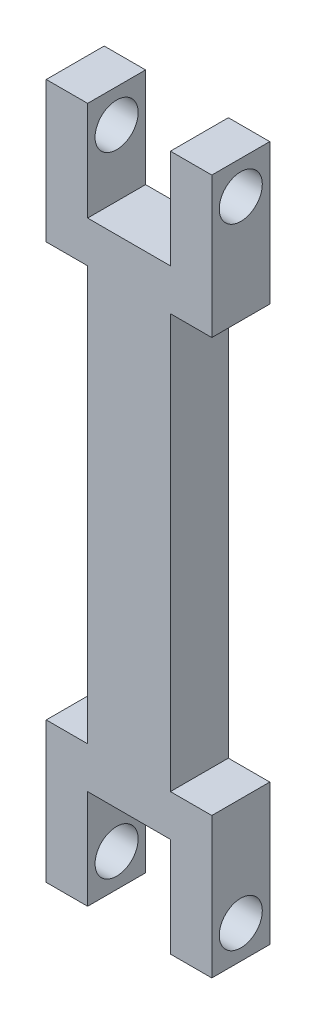
ISO-10303-21;
HEADER;
FILE_DESCRIPTION(('STEP AP214'),'2;1');
FILE_NAME('part.step','',(''),(''),'','','');
FILE_SCHEMA(('AUTOMOTIVE_DESIGN { 1 0 10303 214 1 1 1 1 }'));
ENDSEC;
DATA;
#1=APPLICATION_CONTEXT('core data for automotive mechanical design processes');
#2=APPLICATION_PROTOCOL_DEFINITION('international standard','automotive_design',2000,#1);
#3=PRODUCT_CONTEXT('',#1,'mechanical');
#4=PRODUCT('Part','Part','',(#3));
#5=PRODUCT_RELATED_PRODUCT_CATEGORY('part','',(#4));
#6=PRODUCT_DEFINITION_FORMATION('','',#4);
#7=PRODUCT_DEFINITION_CONTEXT('part definition',#1,'design');
#8=PRODUCT_DEFINITION('design','',#6,#7);
#9=PRODUCT_DEFINITION_SHAPE('','',#8);
#10=(LENGTH_UNIT() NAMED_UNIT(*) SI_UNIT(.MILLI.,.METRE.));
#11=(NAMED_UNIT(*) PLANE_ANGLE_UNIT() SI_UNIT($,.RADIAN.));
#12=(NAMED_UNIT(*) SI_UNIT($,.STERADIAN.) SOLID_ANGLE_UNIT());
#13=UNCERTAINTY_MEASURE_WITH_UNIT(LENGTH_MEASURE(1.E-05),#10,'distance_accuracy_value','');
#14=(GEOMETRIC_REPRESENTATION_CONTEXT(3) GLOBAL_UNCERTAINTY_ASSIGNED_CONTEXT((#13)) GLOBAL_UNIT_ASSIGNED_CONTEXT((#10,
#11,#12)) REPRESENTATION_CONTEXT('',''));
#15=CARTESIAN_POINT('',(0.,0.,0.));
#16=DIRECTION('',(0.,0.,1.));
#17=DIRECTION('',(1.,0.,0.));
#18=AXIS2_PLACEMENT_3D('',#15,#16,#17);
#19=CARTESIAN_POINT('',(0.,0.,0.));
#20=DIRECTION('',(0.,-1.,0.));
#21=DIRECTION('',(0.,0.,-1.));
#22=AXIS2_PLACEMENT_3D('',#19,#20,#21);
#23=PLANE('',#22);
#24=DIRECTION('',(-1.,0.,0.));
#25=VECTOR('',#24,1.);
#26=CARTESIAN_POINT('',(0.,0.,-8.89));
#27=LINE('',#26,#25);
#28=CARTESIAN_POINT('',(12.7,0.,-8.89));
#29=VERTEX_POINT('',#28);
#30=CARTESIAN_POINT('',(0.,0.,-8.89));
#31=VERTEX_POINT('',#30);
#32=EDGE_CURVE('E63',#29,#31,#27,.T.);
#33=ORIENTED_EDGE('',*,*,#32,.F.);
#34=DIRECTION('',(0.,0.,-1.));
#35=VECTOR('',#34,1.);
#36=CARTESIAN_POINT('',(12.7,0.,0.));
#37=LINE('',#36,#35);
#38=CARTESIAN_POINT('',(12.7,0.,0.));
#39=VERTEX_POINT('',#38);
#40=EDGE_CURVE('E188',#39,#29,#37,.T.);
#41=ORIENTED_EDGE('',*,*,#40,.F.);
#42=DIRECTION('',(1.,0.,0.));
#43=VECTOR('',#42,1.);
#44=CARTESIAN_POINT('',(0.,0.,0.));
#45=LINE('',#44,#43);
#46=CARTESIAN_POINT('',(0.,0.,0.));
#47=VERTEX_POINT('',#46);
#48=EDGE_CURVE('E210',#47,#39,#45,.T.);
#49=ORIENTED_EDGE('',*,*,#48,.F.);
#50=DIRECTION('',(0.,0.,1.));
#51=VECTOR('',#50,1.);
#52=CARTESIAN_POINT('',(0.,0.,0.));
#53=LINE('',#52,#51);
#54=EDGE_CURVE('E197',#31,#47,#53,.T.);
#55=ORIENTED_EDGE('',*,*,#54,.F.);
#56=EDGE_LOOP('',(#33,#41,#49,#55));
#57=FACE_BOUND('',#56,.T.);
#58=ADVANCED_FACE('F45',(#57),#23,.T.);
#59=CARTESIAN_POINT('',(0.,76.2,0.));
#60=DIRECTION('',(0.,-1.,0.));
#61=DIRECTION('',(0.,0.,-1.));
#62=AXIS2_PLACEMENT_3D('',#59,#60,#61);
#63=PLANE('',#62);
#64=DIRECTION('',(0.,0.,1.));
#65=VECTOR('',#64,1.);
#66=CARTESIAN_POINT('',(12.7,76.2,-8.89));
#67=LINE('',#66,#65);
#68=CARTESIAN_POINT('',(12.7,76.2,-8.89));
#69=VERTEX_POINT('',#68);
#70=CARTESIAN_POINT('',(12.7,76.2,0.));
#71=VERTEX_POINT('',#70);
#72=EDGE_CURVE('E297',#69,#71,#67,.T.);
#73=ORIENTED_EDGE('',*,*,#72,.F.);
#74=DIRECTION('',(-1.,0.,0.));
#75=VECTOR('',#74,1.);
#76=CARTESIAN_POINT('',(0.,76.2,-8.89));
#77=LINE('',#76,#75);
#78=CARTESIAN_POINT('',(0.,76.2,-8.89));
#79=VERTEX_POINT('',#78);
#80=EDGE_CURVE('E214',#69,#79,#77,.T.);
#81=ORIENTED_EDGE('',*,*,#80,.T.);
#82=DIRECTION('',(0.,0.,-1.));
#83=VECTOR('',#82,1.);
#84=CARTESIAN_POINT('',(0.,76.2,-8.89));
#85=LINE('',#84,#83);
#86=CARTESIAN_POINT('',(0.,76.2,0.));
#87=VERTEX_POINT('',#86);
#88=EDGE_CURVE('E71',#87,#79,#85,.T.);
#89=ORIENTED_EDGE('',*,*,#88,.F.);
#90=DIRECTION('',(1.,0.,0.));
#91=VECTOR('',#90,1.);
#92=CARTESIAN_POINT('',(0.,76.2,0.));
#93=LINE('',#92,#91);
#94=EDGE_CURVE('E209',#87,#71,#93,.T.);
#95=ORIENTED_EDGE('',*,*,#94,.T.);
#96=EDGE_LOOP('',(#73,#81,#89,#95));
#97=FACE_BOUND('',#96,.T.);
#98=ADVANCED_FACE('F423',(#97),#63,.F.);
#99=CARTESIAN_POINT('',(0.,76.2,0.));
#100=DIRECTION('',(1.,0.,0.));
#101=DIRECTION('',(0.,0.,-1.));
#102=AXIS2_PLACEMENT_3D('',#99,#100,#101);
#103=PLANE('',#102);
#104=DIRECTION('',(0.,0.,-1.));
#105=VECTOR('',#104,1.);
#106=CARTESIAN_POINT('',(0.,6.35,-8.89));
#107=LINE('',#106,#105);
#108=CARTESIAN_POINT('',(0.,6.35000000000002,0.));
#109=VERTEX_POINT('',#108);
#110=CARTESIAN_POINT('',(0.,6.35000000000002,-8.89));
#111=VERTEX_POINT('',#110);
#112=EDGE_CURVE('E347',#109,#111,#107,.T.);
#113=ORIENTED_EDGE('',*,*,#112,.F.);
#114=DIRECTION('',(0.,-1.,0.));
#115=VECTOR('',#114,1.);
#116=CARTESIAN_POINT('',(0.,76.2,0.));
#117=LINE('',#116,#115);
#118=CARTESIAN_POINT('',(0.,69.85,0.));
#119=VERTEX_POINT('',#118);
#120=EDGE_CURVE('E11',#119,#109,#117,.T.);
#121=ORIENTED_EDGE('',*,*,#120,.F.);
#122=DIRECTION('',(0.,0.,1.));
#123=VECTOR('',#122,1.);
#124=CARTESIAN_POINT('',(0.,69.85,-8.89));
#125=LINE('',#124,#123);
#126=CARTESIAN_POINT('',(0.,69.85,-8.89));
#127=VERTEX_POINT('',#126);
#128=EDGE_CURVE('E351',#127,#119,#125,.T.);
#129=ORIENTED_EDGE('',*,*,#128,.F.);
#130=DIRECTION('',(0.,-1.,0.));
#131=VECTOR('',#130,1.);
#132=CARTESIAN_POINT('',(0.,76.2,-8.89));
#133=LINE('',#132,#131);
#134=EDGE_CURVE('E220',#127,#111,#133,.T.);
#135=ORIENTED_EDGE('',*,*,#134,.T.);
#136=EDGE_LOOP('',(#113,#121,#129,#135));
#137=FACE_BOUND('',#136,.T.);
#138=ADVANCED_FACE('F47',(#137),#103,.F.);
#139=CARTESIAN_POINT('',(12.7,76.2,0.));
#140=DIRECTION('',(-1.,0.,0.));
#141=DIRECTION('',(0.,0.,1.));
#142=AXIS2_PLACEMENT_3D('',#139,#140,#141);
#143=PLANE('',#142);
#144=DIRECTION('',(0.,0.,-1.));
#145=VECTOR('',#144,1.);
#146=CARTESIAN_POINT('',(12.7,69.85,0.));
#147=LINE('',#146,#145);
#148=CARTESIAN_POINT('',(12.7,69.85,0.));
#149=VERTEX_POINT('',#148);
#150=CARTESIAN_POINT('',(12.7,69.85,-8.89));
#151=VERTEX_POINT('',#150);
#152=EDGE_CURVE('E389',#149,#151,#147,.T.);
#153=ORIENTED_EDGE('',*,*,#152,.F.);
#154=DIRECTION('',(0.,-1.,0.));
#155=VECTOR('',#154,1.);
#156=CARTESIAN_POINT('',(12.7,76.2,0.));
#157=LINE('',#156,#155);
#158=CARTESIAN_POINT('',(12.7,6.35,0.));
#159=VERTEX_POINT('',#158);
#160=EDGE_CURVE('E55',#149,#159,#157,.T.);
#161=ORIENTED_EDGE('',*,*,#160,.T.);
#162=DIRECTION('',(0.,0.,1.));
#163=VECTOR('',#162,1.);
#164=CARTESIAN_POINT('',(12.7,6.35,0.));
#165=LINE('',#164,#163);
#166=CARTESIAN_POINT('',(12.7,6.35000000000002,-8.89));
#167=VERTEX_POINT('',#166);
#168=EDGE_CURVE('E392',#167,#159,#165,.T.);
#169=ORIENTED_EDGE('',*,*,#168,.F.);
#170=DIRECTION('',(0.,-1.,0.));
#171=VECTOR('',#170,1.);
#172=CARTESIAN_POINT('',(12.7,76.2,-8.89));
#173=LINE('',#172,#171);
#174=EDGE_CURVE('E223',#151,#167,#173,.T.);
#175=ORIENTED_EDGE('',*,*,#174,.F.);
#176=EDGE_LOOP('',(#153,#161,#169,#175));
#177=FACE_BOUND('',#176,.T.);
#178=ADVANCED_FACE('F459',(#177),#143,.F.);
#179=CARTESIAN_POINT('',(0.,76.2,0.));
#180=DIRECTION('',(0.,0.,-1.));
#181=DIRECTION('',(-1.,0.,0.));
#182=AXIS2_PLACEMENT_3D('',#179,#180,#181);
#183=PLANE('',#182);
#184=DIRECTION('',(0.,1.,0.));
#185=VECTOR('',#184,1.);
#186=CARTESIAN_POINT('',(-6.35,0.,0.));
#187=LINE('',#186,#185);
#188=CARTESIAN_POINT('',(-6.35,-15.24,0.));
#189=VERTEX_POINT('',#188);
#190=CARTESIAN_POINT('',(-6.35,6.35,0.));
#191=VERTEX_POINT('',#190);
#192=EDGE_CURVE('E355',#189,#191,#187,.T.);
#193=ORIENTED_EDGE('',*,*,#192,.F.);
#194=DIRECTION('',(-1.,0.,0.));
#195=VECTOR('',#194,1.);
#196=CARTESIAN_POINT('',(-6.35,-15.24,0.));
#197=LINE('',#196,#195);
#198=CARTESIAN_POINT('',(0.,-15.24,0.));
#199=VERTEX_POINT('',#198);
#200=EDGE_CURVE('E266',#199,#189,#197,.T.);
#201=ORIENTED_EDGE('',*,*,#200,.F.);
#202=DIRECTION('',(0.,1.,0.));
#203=VECTOR('',#202,1.);
#204=CARTESIAN_POINT('',(0.,-15.24,0.));
#205=LINE('',#204,#203);
#206=EDGE_CURVE('E280',#199,#47,#205,.T.);
#207=ORIENTED_EDGE('',*,*,#206,.T.);
#208=ORIENTED_EDGE('',*,*,#48,.T.);
#209=DIRECTION('',(0.,1.,0.));
#210=VECTOR('',#209,1.);
#211=CARTESIAN_POINT('',(12.7,-15.24,0.));
#212=LINE('',#211,#210);
#213=CARTESIAN_POINT('',(12.7,-15.24,0.));
#214=VERTEX_POINT('',#213);
#215=EDGE_CURVE('E193',#214,#39,#212,.T.);
#216=ORIENTED_EDGE('',*,*,#215,.F.);
#217=DIRECTION('',(-1.,0.,0.));
#218=VECTOR('',#217,1.);
#219=CARTESIAN_POINT('',(19.05,-15.24,0.));
#220=LINE('',#219,#218);
#221=CARTESIAN_POINT('',(19.05,-15.24,0.));
#222=VERTEX_POINT('',#221);
#223=EDGE_CURVE('E198',#222,#214,#220,.T.);
#224=ORIENTED_EDGE('',*,*,#223,.F.);
#225=DIRECTION('',(0.,-1.,0.));
#226=VECTOR('',#225,1.);
#227=CARTESIAN_POINT('',(19.05,0.,0.));
#228=LINE('',#227,#226);
#229=CARTESIAN_POINT('',(19.05,6.35,0.));
#230=VERTEX_POINT('',#229);
#231=EDGE_CURVE('E402',#230,#222,#228,.T.);
#232=ORIENTED_EDGE('',*,*,#231,.F.);
#233=DIRECTION('',(-1.,0.,0.));
#234=VECTOR('',#233,1.);
#235=CARTESIAN_POINT('',(19.05,6.35,0.));
#236=LINE('',#235,#234);
#237=EDGE_CURVE('E411',#230,#159,#236,.T.);
#238=ORIENTED_EDGE('',*,*,#237,.T.);
#239=ORIENTED_EDGE('',*,*,#160,.F.);
#240=DIRECTION('',(-1.,0.,0.));
#241=VECTOR('',#240,1.);
#242=CARTESIAN_POINT('',(19.05,69.85,0.));
#243=LINE('',#242,#241);
#244=CARTESIAN_POINT('',(19.05,69.85,0.));
#245=VERTEX_POINT('',#244);
#246=EDGE_CURVE('E381',#245,#149,#243,.T.);
#247=ORIENTED_EDGE('',*,*,#246,.F.);
#248=DIRECTION('',(0.,-1.,0.));
#249=VECTOR('',#248,1.);
#250=CARTESIAN_POINT('',(19.05,76.2,0.));
#251=LINE('',#250,#249);
#252=CARTESIAN_POINT('',(19.05,91.44,0.));
#253=VERTEX_POINT('',#252);
#254=EDGE_CURVE('E393',#253,#245,#251,.T.);
#255=ORIENTED_EDGE('',*,*,#254,.F.);
#256=DIRECTION('',(1.,0.,0.));
#257=VECTOR('',#256,1.);
#258=CARTESIAN_POINT('',(19.05,91.44,0.));
#259=LINE('',#258,#257);
#260=CARTESIAN_POINT('',(12.7,91.44,0.));
#261=VERTEX_POINT('',#260);
#262=EDGE_CURVE('E304',#261,#253,#259,.T.);
#263=ORIENTED_EDGE('',*,*,#262,.F.);
#264=DIRECTION('',(0.,-1.,0.));
#265=VECTOR('',#264,1.);
#266=CARTESIAN_POINT('',(12.7,91.44,0.));
#267=LINE('',#266,#265);
#268=EDGE_CURVE('E292',#261,#71,#267,.T.);
#269=ORIENTED_EDGE('',*,*,#268,.T.);
#270=ORIENTED_EDGE('',*,*,#94,.F.);
#271=DIRECTION('',(0.,-1.,0.));
#272=VECTOR('',#271,1.);
#273=CARTESIAN_POINT('',(0.,91.44,0.));
#274=LINE('',#273,#272);
#275=CARTESIAN_POINT('',(0.,91.44,0.));
#276=VERTEX_POINT('',#275);
#277=EDGE_CURVE('E334',#276,#87,#274,.T.);
#278=ORIENTED_EDGE('',*,*,#277,.F.);
#279=DIRECTION('',(1.,0.,0.));
#280=VECTOR('',#279,1.);
#281=CARTESIAN_POINT('',(-6.35,91.44,0.));
#282=LINE('',#281,#280);
#283=CARTESIAN_POINT('',(-6.35,91.44,0.));
#284=VERTEX_POINT('',#283);
#285=EDGE_CURVE('E322',#284,#276,#282,.T.);
#286=ORIENTED_EDGE('',*,*,#285,.F.);
#287=DIRECTION('',(0.,1.,0.));
#288=VECTOR('',#287,1.);
#289=CARTESIAN_POINT('',(-6.35,76.2,0.));
#290=LINE('',#289,#288);
#291=CARTESIAN_POINT('',(-6.35,69.85,0.));
#292=VERTEX_POINT('',#291);
#293=EDGE_CURVE('E367',#292,#284,#290,.T.);
#294=ORIENTED_EDGE('',*,*,#293,.F.);
#295=DIRECTION('',(1.,0.,0.));
#296=VECTOR('',#295,1.);
#297=CARTESIAN_POINT('',(-6.35,69.85,0.));
#298=LINE('',#297,#296);
#299=EDGE_CURVE('E370',#292,#119,#298,.T.);
#300=ORIENTED_EDGE('',*,*,#299,.T.);
#301=ORIENTED_EDGE('',*,*,#120,.T.);
#302=DIRECTION('',(1.,0.,0.));
#303=VECTOR('',#302,1.);
#304=CARTESIAN_POINT('',(-6.35,6.35,0.));
#305=LINE('',#304,#303);
#306=EDGE_CURVE('E338',#191,#109,#305,.T.);
#307=ORIENTED_EDGE('',*,*,#306,.F.);
#308=EDGE_LOOP('',(#193,#201,#207,#208,#216,#224,#232,#238,#239,#247,#255,#263,#269,#270,#278,
#286,#294,#300,#301,#307));
#309=FACE_BOUND('',#308,.T.);
#310=ADVANCED_FACE('F438',(#309),#183,.F.);
#311=CARTESIAN_POINT('',(0.,76.2,-8.89));
#312=DIRECTION('',(0.,0.,1.));
#313=DIRECTION('',(1.,0.,0.));
#314=AXIS2_PLACEMENT_3D('',#311,#312,#313);
#315=PLANE('',#314);
#316=DIRECTION('',(0.,1.,0.));
#317=VECTOR('',#316,1.);
#318=CARTESIAN_POINT('',(19.05,0.,-8.89));
#319=LINE('',#318,#317);
#320=CARTESIAN_POINT('',(19.05,-15.24,-8.89));
#321=VERTEX_POINT('',#320);
#322=CARTESIAN_POINT('',(19.05,6.35,-8.89));
#323=VERTEX_POINT('',#322);
#324=EDGE_CURVE('E405',#321,#323,#319,.T.);
#325=ORIENTED_EDGE('',*,*,#324,.F.);
#326=DIRECTION('',(1.,0.,0.));
#327=VECTOR('',#326,1.);
#328=CARTESIAN_POINT('',(19.05,-15.24,-8.89));
#329=LINE('',#328,#327);
#330=CARTESIAN_POINT('',(12.7,-15.24,-8.89));
#331=VERTEX_POINT('',#330);
#332=EDGE_CURVE('E202',#331,#321,#329,.T.);
#333=ORIENTED_EDGE('',*,*,#332,.F.);
#334=DIRECTION('',(0.,1.,0.));
#335=VECTOR('',#334,1.);
#336=CARTESIAN_POINT('',(12.7,-15.24,-8.89));
#337=LINE('',#336,#335);
#338=EDGE_CURVE('E190',#331,#29,#337,.T.);
#339=ORIENTED_EDGE('',*,*,#338,.T.);
#340=ORIENTED_EDGE('',*,*,#32,.T.);
#341=DIRECTION('',(0.,1.,0.));
#342=VECTOR('',#341,1.);
#343=CARTESIAN_POINT('',(0.,-15.24,-8.89));
#344=LINE('',#343,#342);
#345=CARTESIAN_POINT('',(0.,-15.24,-8.89));
#346=VERTEX_POINT('',#345);
#347=EDGE_CURVE('E286',#346,#31,#344,.T.);
#348=ORIENTED_EDGE('',*,*,#347,.F.);
#349=DIRECTION('',(1.,0.,0.));
#350=VECTOR('',#349,1.);
#351=CARTESIAN_POINT('',(-6.35,-15.24,-8.89));
#352=LINE('',#351,#350);
#353=CARTESIAN_POINT('',(-6.35,-15.24,-8.89));
#354=VERTEX_POINT('',#353);
#355=EDGE_CURVE('E274',#354,#346,#352,.T.);
#356=ORIENTED_EDGE('',*,*,#355,.F.);
#357=DIRECTION('',(0.,-1.,0.));
#358=VECTOR('',#357,1.);
#359=CARTESIAN_POINT('',(-6.35,0.,-8.89));
#360=LINE('',#359,#358);
#361=CARTESIAN_POINT('',(-6.35,6.35,-8.89));
#362=VERTEX_POINT('',#361);
#363=EDGE_CURVE('E352',#362,#354,#360,.T.);
#364=ORIENTED_EDGE('',*,*,#363,.F.);
#365=DIRECTION('',(1.,0.,0.));
#366=VECTOR('',#365,1.);
#367=CARTESIAN_POINT('',(-6.35,6.35,-8.89));
#368=LINE('',#367,#366);
#369=EDGE_CURVE('E342',#362,#111,#368,.T.);
#370=ORIENTED_EDGE('',*,*,#369,.T.);
#371=ORIENTED_EDGE('',*,*,#134,.F.);
#372=DIRECTION('',(1.,0.,0.));
#373=VECTOR('',#372,1.);
#374=CARTESIAN_POINT('',(-6.35,69.85,-8.89));
#375=LINE('',#374,#373);
#376=CARTESIAN_POINT('',(-6.35,69.85,-8.89));
#377=VERTEX_POINT('',#376);
#378=EDGE_CURVE('E377',#377,#127,#375,.T.);
#379=ORIENTED_EDGE('',*,*,#378,.F.);
#380=DIRECTION('',(0.,-1.,0.));
#381=VECTOR('',#380,1.);
#382=CARTESIAN_POINT('',(-6.35,76.2,-8.89));
#383=LINE('',#382,#381);
#384=CARTESIAN_POINT('',(-6.35,91.44,-8.89));
#385=VERTEX_POINT('',#384);
#386=EDGE_CURVE('E360',#385,#377,#383,.T.);
#387=ORIENTED_EDGE('',*,*,#386,.F.);
#388=DIRECTION('',(-1.,0.,0.));
#389=VECTOR('',#388,1.);
#390=CARTESIAN_POINT('',(-6.35,91.44,-8.89));
#391=LINE('',#390,#389);
#392=CARTESIAN_POINT('',(0.,91.44,-8.89));
#393=VERTEX_POINT('',#392);
#394=EDGE_CURVE('E314',#393,#385,#391,.T.);
#395=ORIENTED_EDGE('',*,*,#394,.F.);
#396=DIRECTION('',(0.,-1.,0.));
#397=VECTOR('',#396,1.);
#398=CARTESIAN_POINT('',(0.,91.44,-8.89));
#399=LINE('',#398,#397);
#400=EDGE_CURVE('E328',#393,#79,#399,.T.);
#401=ORIENTED_EDGE('',*,*,#400,.T.);
#402=ORIENTED_EDGE('',*,*,#80,.F.);
#403=DIRECTION('',(0.,-1.,0.));
#404=VECTOR('',#403,1.);
#405=CARTESIAN_POINT('',(12.7,91.44,-8.89));
#406=LINE('',#405,#404);
#407=CARTESIAN_POINT('',(12.7,91.44,-8.89));
#408=VERTEX_POINT('',#407);
#409=EDGE_CURVE('E289',#408,#69,#406,.T.);
#410=ORIENTED_EDGE('',*,*,#409,.F.);
#411=DIRECTION('',(-1.,0.,0.));
#412=VECTOR('',#411,1.);
#413=CARTESIAN_POINT('',(19.05,91.44,-8.89));
#414=LINE('',#413,#412);
#415=CARTESIAN_POINT('',(19.05,91.44,-8.89));
#416=VERTEX_POINT('',#415);
#417=EDGE_CURVE('E300',#416,#408,#414,.T.);
#418=ORIENTED_EDGE('',*,*,#417,.F.);
#419=DIRECTION('',(0.,1.,0.));
#420=VECTOR('',#419,1.);
#421=CARTESIAN_POINT('',(19.05,76.2,-8.89));
#422=LINE('',#421,#420);
#423=CARTESIAN_POINT('',(19.05,69.85,-8.89));
#424=VERTEX_POINT('',#423);
#425=EDGE_CURVE('E388',#424,#416,#422,.T.);
#426=ORIENTED_EDGE('',*,*,#425,.F.);
#427=DIRECTION('',(-1.,0.,0.));
#428=VECTOR('',#427,1.);
#429=CARTESIAN_POINT('',(19.05,69.85,-8.89));
#430=LINE('',#429,#428);
#431=EDGE_CURVE('E384',#424,#151,#430,.T.);
#432=ORIENTED_EDGE('',*,*,#431,.T.);
#433=ORIENTED_EDGE('',*,*,#174,.T.);
#434=DIRECTION('',(-1.,0.,0.));
#435=VECTOR('',#434,1.);
#436=CARTESIAN_POINT('',(19.05,6.35,-8.89));
#437=LINE('',#436,#435);
#438=EDGE_CURVE('E216',#323,#167,#437,.T.);
#439=ORIENTED_EDGE('',*,*,#438,.F.);
#440=EDGE_LOOP('',(#325,#333,#339,#340,#348,#356,#364,#370,#371,#379,#387,#395,#401,#402,#410,
#418,#426,#432,#433,#439));
#441=FACE_BOUND('',#440,.T.);
#442=ADVANCED_FACE('F200',(#441),#315,.F.);
#443=CARTESIAN_POINT('',(19.05,6.35,0.));
#444=DIRECTION('',(0.,-1.,0.));
#445=DIRECTION('',(0.,0.,-1.));
#446=AXIS2_PLACEMENT_3D('',#443,#444,#445);
#447=PLANE('',#446);
#448=ORIENTED_EDGE('',*,*,#168,.T.);
#449=ORIENTED_EDGE('',*,*,#237,.F.);
#450=DIRECTION('',(0.,0.,1.));
#451=VECTOR('',#450,1.);
#452=CARTESIAN_POINT('',(19.05,6.35,0.));
#453=LINE('',#452,#451);
#454=EDGE_CURVE('E408',#323,#230,#453,.T.);
#455=ORIENTED_EDGE('',*,*,#454,.F.);
#456=ORIENTED_EDGE('',*,*,#438,.T.);
#457=EDGE_LOOP('',(#448,#449,#455,#456));
#458=FACE_BOUND('',#457,.T.);
#459=ADVANCED_FACE('F464',(#458),#447,.F.);
#460=CARTESIAN_POINT('',(19.05,0.,0.));
#461=DIRECTION('',(-1.,0.,0.));
#462=DIRECTION('',(0.,0.,1.));
#463=AXIS2_PLACEMENT_3D('',#460,#461,#462);
#464=PLANE('',#463);
#465=CARTESIAN_POINT('',(19.05,-10.16,-4.445));
#466=DIRECTION('',(1.,0.,0.));
#467=DIRECTION('',(0.,0.,-1.));
#468=AXIS2_PLACEMENT_3D('',#465,#466,#467);
#469=CIRCLE('',#468,3.302);
#470=CARTESIAN_POINT('',(19.05,-10.16,-7.747));
#471=VERTEX_POINT('',#470);
#472=EDGE_CURVE('E231',#471,#471,#469,.T.);
#473=ORIENTED_EDGE('',*,*,#472,.F.);
#474=EDGE_LOOP('',(#473));
#475=FACE_BOUND('',#474,.T.);
#476=ORIENTED_EDGE('',*,*,#231,.T.);
#477=DIRECTION('',(0.,0.,1.));
#478=VECTOR('',#477,1.);
#479=CARTESIAN_POINT('',(19.05,-15.24,0.));
#480=LINE('',#479,#478);
#481=EDGE_CURVE('E204',#321,#222,#480,.T.);
#482=ORIENTED_EDGE('',*,*,#481,.F.);
#483=ORIENTED_EDGE('',*,*,#324,.T.);
#484=ORIENTED_EDGE('',*,*,#454,.T.);
#485=EDGE_LOOP('',(#476,#482,#483,#484));
#486=FACE_BOUND('',#485,.T.);
#487=ADVANCED_FACE('F470',(#475,#486),#464,.F.);
#488=CARTESIAN_POINT('',(19.05,69.85,0.));
#489=DIRECTION('',(0.,1.,0.));
#490=DIRECTION('',(0.,0.,1.));
#491=AXIS2_PLACEMENT_3D('',#488,#489,#490);
#492=PLANE('',#491);
#493=ORIENTED_EDGE('',*,*,#152,.T.);
#494=ORIENTED_EDGE('',*,*,#431,.F.);
#495=DIRECTION('',(0.,0.,-1.));
#496=VECTOR('',#495,1.);
#497=CARTESIAN_POINT('',(19.05,69.85,0.));
#498=LINE('',#497,#496);
#499=EDGE_CURVE('E396',#245,#424,#498,.T.);
#500=ORIENTED_EDGE('',*,*,#499,.F.);
#501=ORIENTED_EDGE('',*,*,#246,.T.);
#502=EDGE_LOOP('',(#493,#494,#500,#501));
#503=FACE_BOUND('',#502,.T.);
#504=ADVANCED_FACE('F453',(#503),#492,.F.);
#505=CARTESIAN_POINT('',(19.05,0.,0.));
#506=DIRECTION('',(1.,0.,0.));
#507=DIRECTION('',(0.,0.,-1.));
#508=AXIS2_PLACEMENT_3D('',#505,#506,#507);
#509=PLANE('',#508);
#510=CARTESIAN_POINT('',(19.05,86.36,-4.445));
#511=DIRECTION('',(1.,0.,0.));
#512=DIRECTION('',(0.,0.,-1.));
#513=AXIS2_PLACEMENT_3D('',#510,#511,#512);
#514=CIRCLE('',#513,3.30199999999999);
#515=CARTESIAN_POINT('',(19.05,86.36,-7.74699999999999));
#516=VERTEX_POINT('',#515);
#517=EDGE_CURVE('E793',#516,#516,#514,.T.);
#518=ORIENTED_EDGE('',*,*,#517,.F.);
#519=EDGE_LOOP('',(#518));
#520=FACE_BOUND('',#519,.T.);
#521=ORIENTED_EDGE('',*,*,#254,.T.);
#522=ORIENTED_EDGE('',*,*,#499,.T.);
#523=ORIENTED_EDGE('',*,*,#425,.T.);
#524=DIRECTION('',(0.,0.,-1.));
#525=VECTOR('',#524,1.);
#526=CARTESIAN_POINT('',(19.05,91.44,-8.89));
#527=LINE('',#526,#525);
#528=EDGE_CURVE('E296',#253,#416,#527,.T.);
#529=ORIENTED_EDGE('',*,*,#528,.F.);
#530=EDGE_LOOP('',(#521,#522,#523,#529));
#531=FACE_BOUND('',#530,.T.);
#532=ADVANCED_FACE('F449',(#520,#531),#509,.T.);
#533=CARTESIAN_POINT('',(-6.35,69.85,-8.89));
#534=DIRECTION('',(0.,1.,0.));
#535=DIRECTION('',(0.,0.,1.));
#536=AXIS2_PLACEMENT_3D('',#533,#534,#535);
#537=PLANE('',#536);
#538=ORIENTED_EDGE('',*,*,#128,.T.);
#539=ORIENTED_EDGE('',*,*,#299,.F.);
#540=DIRECTION('',(0.,0.,1.));
#541=VECTOR('',#540,1.);
#542=CARTESIAN_POINT('',(-6.35,69.85,-8.89));
#543=LINE('',#542,#541);
#544=EDGE_CURVE('E364',#377,#292,#543,.T.);
#545=ORIENTED_EDGE('',*,*,#544,.F.);
#546=ORIENTED_EDGE('',*,*,#378,.T.);
#547=EDGE_LOOP('',(#538,#539,#545,#546));
#548=FACE_BOUND('',#547,.T.);
#549=ADVANCED_FACE('F492',(#548),#537,.F.);
#550=CARTESIAN_POINT('',(-6.35,0.,0.));
#551=DIRECTION('',(-1.,0.,0.));
#552=DIRECTION('',(0.,0.,1.));
#553=AXIS2_PLACEMENT_3D('',#550,#551,#552);
#554=PLANE('',#553);
#555=CARTESIAN_POINT('',(-6.35,86.36,-4.445));
#556=DIRECTION('',(-1.,0.,0.));
#557=DIRECTION('',(0.,0.,1.));
#558=AXIS2_PLACEMENT_3D('',#555,#556,#557);
#559=CIRCLE('',#558,3.30199999999999);
#560=CARTESIAN_POINT('',(-6.35,86.36,-1.14300000000001));
#561=VERTEX_POINT('',#560);
#562=EDGE_CURVE('E240',#561,#561,#559,.T.);
#563=ORIENTED_EDGE('',*,*,#562,.F.);
#564=EDGE_LOOP('',(#563));
#565=FACE_BOUND('',#564,.T.);
#566=ORIENTED_EDGE('',*,*,#386,.T.);
#567=ORIENTED_EDGE('',*,*,#544,.T.);
#568=ORIENTED_EDGE('',*,*,#293,.T.);
#569=DIRECTION('',(0.,0.,1.));
#570=VECTOR('',#569,1.);
#571=CARTESIAN_POINT('',(-6.35,91.44,-8.89));
#572=LINE('',#571,#570);
#573=EDGE_CURVE('E318',#385,#284,#572,.T.);
#574=ORIENTED_EDGE('',*,*,#573,.F.);
#575=EDGE_LOOP('',(#566,#567,#568,#574));
#576=FACE_BOUND('',#575,.T.);
#577=ADVANCED_FACE('F495',(#565,#576),#554,.T.);
#578=CARTESIAN_POINT('',(-6.35,6.35,-8.89));
#579=DIRECTION('',(0.,-1.,0.));
#580=DIRECTION('',(0.,0.,-1.));
#581=AXIS2_PLACEMENT_3D('',#578,#579,#580);
#582=PLANE('',#581);
#583=ORIENTED_EDGE('',*,*,#112,.T.);
#584=ORIENTED_EDGE('',*,*,#369,.F.);
#585=DIRECTION('',(0.,0.,-1.));
#586=VECTOR('',#585,1.);
#587=CARTESIAN_POINT('',(-6.35,6.35,-8.89));
#588=LINE('',#587,#586);
#589=EDGE_CURVE('E346',#191,#362,#588,.T.);
#590=ORIENTED_EDGE('',*,*,#589,.F.);
#591=ORIENTED_EDGE('',*,*,#306,.T.);
#592=EDGE_LOOP('',(#583,#584,#590,#591));
#593=FACE_BOUND('',#592,.T.);
#594=ADVANCED_FACE('F488',(#593),#582,.F.);
#595=CARTESIAN_POINT('',(-6.35,0.,0.));
#596=DIRECTION('',(1.,0.,0.));
#597=DIRECTION('',(0.,0.,-1.));
#598=AXIS2_PLACEMENT_3D('',#595,#596,#597);
#599=PLANE('',#598);
#600=CARTESIAN_POINT('',(-6.35,-10.16,-4.445));
#601=DIRECTION('',(1.,0.,0.));
#602=DIRECTION('',(0.,0.,-1.));
#603=AXIS2_PLACEMENT_3D('',#600,#601,#602);
#604=CIRCLE('',#603,3.302);
#605=CARTESIAN_POINT('',(-6.35,-10.16,-7.747));
#606=VERTEX_POINT('',#605);
#607=EDGE_CURVE('E237',#606,#606,#604,.T.);
#608=ORIENTED_EDGE('',*,*,#607,.T.);
#609=EDGE_LOOP('',(#608));
#610=FACE_BOUND('',#609,.T.);
#611=ORIENTED_EDGE('',*,*,#363,.T.);
#612=DIRECTION('',(0.,0.,-1.));
#613=VECTOR('',#612,1.);
#614=CARTESIAN_POINT('',(-6.35,-15.24,0.));
#615=LINE('',#614,#613);
#616=EDGE_CURVE('E270',#189,#354,#615,.T.);
#617=ORIENTED_EDGE('',*,*,#616,.F.);
#618=ORIENTED_EDGE('',*,*,#192,.T.);
#619=ORIENTED_EDGE('',*,*,#589,.T.);
#620=EDGE_LOOP('',(#611,#617,#618,#619));
#621=FACE_BOUND('',#620,.T.);
#622=ADVANCED_FACE('F483',(#610,#621),#599,.F.);
#623=CARTESIAN_POINT('',(0.,91.44,-8.89));
#624=DIRECTION('',(-1.,0.,0.));
#625=DIRECTION('',(0.,0.,1.));
#626=AXIS2_PLACEMENT_3D('',#623,#624,#625);
#627=PLANE('',#626);
#628=CARTESIAN_POINT('',(0.,86.36,-4.445));
#629=DIRECTION('',(-1.,0.,0.));
#630=DIRECTION('',(0.,0.,1.));
#631=AXIS2_PLACEMENT_3D('',#628,#629,#630);
#632=CIRCLE('',#631,3.30199999999999);
#633=CARTESIAN_POINT('',(0.,86.36,-1.14300000000001));
#634=VERTEX_POINT('',#633);
#635=EDGE_CURVE('E246',#634,#634,#632,.T.);
#636=ORIENTED_EDGE('',*,*,#635,.T.);
#637=EDGE_LOOP('',(#636));
#638=FACE_BOUND('',#637,.T.);
#639=ORIENTED_EDGE('',*,*,#88,.T.);
#640=ORIENTED_EDGE('',*,*,#400,.F.);
#641=DIRECTION('',(0.,0.,-1.));
#642=VECTOR('',#641,1.);
#643=CARTESIAN_POINT('',(0.,91.44,-8.89));
#644=LINE('',#643,#642);
#645=EDGE_CURVE('E325',#276,#393,#644,.T.);
#646=ORIENTED_EDGE('',*,*,#645,.F.);
#647=ORIENTED_EDGE('',*,*,#277,.T.);
#648=EDGE_LOOP('',(#639,#640,#646,#647));
#649=FACE_BOUND('',#648,.T.);
#650=ADVANCED_FACE('F427',(#638,#649),#627,.F.);
#651=CARTESIAN_POINT('',(0.,91.44,0.));
#652=DIRECTION('',(0.,-1.,0.));
#653=DIRECTION('',(0.,0.,-1.));
#654=AXIS2_PLACEMENT_3D('',#651,#652,#653);
#655=PLANE('',#654);
#656=ORIENTED_EDGE('',*,*,#394,.T.);
#657=ORIENTED_EDGE('',*,*,#573,.T.);
#658=ORIENTED_EDGE('',*,*,#285,.T.);
#659=ORIENTED_EDGE('',*,*,#645,.T.);
#660=EDGE_LOOP('',(#656,#657,#658,#659));
#661=FACE_BOUND('',#660,.T.);
#662=ADVANCED_FACE('F434',(#661),#655,.F.);
#663=CARTESIAN_POINT('',(12.7,91.44,-8.89));
#664=DIRECTION('',(1.,0.,0.));
#665=DIRECTION('',(0.,0.,-1.));
#666=AXIS2_PLACEMENT_3D('',#663,#664,#665);
#667=PLANE('',#666);
#668=CARTESIAN_POINT('',(12.7,86.36,-4.445));
#669=DIRECTION('',(1.,0.,0.));
#670=DIRECTION('',(0.,0.,-1.));
#671=AXIS2_PLACEMENT_3D('',#668,#669,#670);
#672=CIRCLE('',#671,3.30199999999999);
#673=CARTESIAN_POINT('',(12.7,86.36,-7.74699999999999));
#674=VERTEX_POINT('',#673);
#675=EDGE_CURVE('E49',#674,#674,#672,.T.);
#676=ORIENTED_EDGE('',*,*,#675,.T.);
#677=EDGE_LOOP('',(#676));
#678=FACE_BOUND('',#677,.T.);
#679=ORIENTED_EDGE('',*,*,#72,.T.);
#680=ORIENTED_EDGE('',*,*,#268,.F.);
#681=DIRECTION('',(0.,0.,1.));
#682=VECTOR('',#681,1.);
#683=CARTESIAN_POINT('',(12.7,91.44,-8.89));
#684=LINE('',#683,#682);
#685=EDGE_CURVE('E308',#408,#261,#684,.T.);
#686=ORIENTED_EDGE('',*,*,#685,.F.);
#687=ORIENTED_EDGE('',*,*,#409,.T.);
#688=EDGE_LOOP('',(#679,#680,#686,#687));
#689=FACE_BOUND('',#688,.T.);
#690=ADVANCED_FACE('F442',(#678,#689),#667,.F.);
#691=CARTESIAN_POINT('',(0.,91.44,0.));
#692=DIRECTION('',(0.,1.,0.));
#693=DIRECTION('',(0.,0.,1.));
#694=AXIS2_PLACEMENT_3D('',#691,#692,#693);
#695=PLANE('',#694);
#696=ORIENTED_EDGE('',*,*,#417,.T.);
#697=ORIENTED_EDGE('',*,*,#685,.T.);
#698=ORIENTED_EDGE('',*,*,#262,.T.);
#699=ORIENTED_EDGE('',*,*,#528,.T.);
#700=EDGE_LOOP('',(#696,#697,#698,#699));
#701=FACE_BOUND('',#700,.T.);
#702=ADVANCED_FACE('F446',(#701),#695,.T.);
#703=CARTESIAN_POINT('',(0.,-15.24,0.));
#704=DIRECTION('',(-1.,0.,0.));
#705=DIRECTION('',(0.,0.,1.));
#706=AXIS2_PLACEMENT_3D('',#703,#704,#705);
#707=PLANE('',#706);
#708=CARTESIAN_POINT('',(0.,-10.16,-4.445));
#709=DIRECTION('',(-1.,0.,0.));
#710=DIRECTION('',(0.,0.,1.));
#711=AXIS2_PLACEMENT_3D('',#708,#709,#710);
#712=CIRCLE('',#711,3.302);
#713=CARTESIAN_POINT('',(0.,-10.16,-1.143));
#714=VERTEX_POINT('',#713);
#715=EDGE_CURVE('E230',#714,#714,#712,.T.);
#716=ORIENTED_EDGE('',*,*,#715,.T.);
#717=EDGE_LOOP('',(#716));
#718=FACE_BOUND('',#717,.T.);
#719=ORIENTED_EDGE('',*,*,#54,.T.);
#720=ORIENTED_EDGE('',*,*,#206,.F.);
#721=DIRECTION('',(0.,0.,1.));
#722=VECTOR('',#721,1.);
#723=CARTESIAN_POINT('',(0.,-15.24,0.));
#724=LINE('',#723,#722);
#725=EDGE_CURVE('E277',#346,#199,#724,.T.);
#726=ORIENTED_EDGE('',*,*,#725,.F.);
#727=ORIENTED_EDGE('',*,*,#347,.T.);
#728=EDGE_LOOP('',(#719,#720,#726,#727));
#729=FACE_BOUND('',#728,.T.);
#730=ADVANCED_FACE('F475',(#718,#729),#707,.F.);
#731=CARTESIAN_POINT('',(0.,-15.24,0.));
#732=DIRECTION('',(0.,1.,0.));
#733=DIRECTION('',(0.,0.,1.));
#734=AXIS2_PLACEMENT_3D('',#731,#732,#733);
#735=PLANE('',#734);
#736=ORIENTED_EDGE('',*,*,#200,.T.);
#737=ORIENTED_EDGE('',*,*,#616,.T.);
#738=ORIENTED_EDGE('',*,*,#355,.T.);
#739=ORIENTED_EDGE('',*,*,#725,.T.);
#740=EDGE_LOOP('',(#736,#737,#738,#739));
#741=FACE_BOUND('',#740,.T.);
#742=ADVANCED_FACE('F480',(#741),#735,.F.);
#743=CARTESIAN_POINT('',(12.7,-15.24,0.));
#744=DIRECTION('',(1.,0.,0.));
#745=DIRECTION('',(0.,0.,-1.));
#746=AXIS2_PLACEMENT_3D('',#743,#744,#745);
#747=PLANE('',#746);
#748=CARTESIAN_POINT('',(12.7,-10.16,-4.445));
#749=DIRECTION('',(1.,0.,0.));
#750=DIRECTION('',(0.,0.,-1.));
#751=AXIS2_PLACEMENT_3D('',#748,#749,#750);
#752=CIRCLE('',#751,3.302);
#753=CARTESIAN_POINT('',(12.7,-10.16,-7.747));
#754=VERTEX_POINT('',#753);
#755=EDGE_CURVE('E227',#754,#754,#752,.T.);
#756=ORIENTED_EDGE('',*,*,#755,.T.);
#757=EDGE_LOOP('',(#756));
#758=FACE_BOUND('',#757,.T.);
#759=ORIENTED_EDGE('',*,*,#40,.T.);
#760=ORIENTED_EDGE('',*,*,#338,.F.);
#761=DIRECTION('',(0.,0.,-1.));
#762=VECTOR('',#761,1.);
#763=CARTESIAN_POINT('',(12.7,-15.24,0.));
#764=LINE('',#763,#762);
#765=EDGE_CURVE('E260',#214,#331,#764,.T.);
#766=ORIENTED_EDGE('',*,*,#765,.F.);
#767=ORIENTED_EDGE('',*,*,#215,.T.);
#768=EDGE_LOOP('',(#759,#760,#766,#767));
#769=FACE_BOUND('',#768,.T.);
#770=ADVANCED_FACE('F189',(#758,#769),#747,.F.);
#771=CARTESIAN_POINT('',(0.,-15.24,0.));
#772=DIRECTION('',(0.,-1.,0.));
#773=DIRECTION('',(0.,0.,-1.));
#774=AXIS2_PLACEMENT_3D('',#771,#772,#773);
#775=PLANE('',#774);
#776=ORIENTED_EDGE('',*,*,#223,.T.);
#777=ORIENTED_EDGE('',*,*,#765,.T.);
#778=ORIENTED_EDGE('',*,*,#332,.T.);
#779=ORIENTED_EDGE('',*,*,#481,.T.);
#780=EDGE_LOOP('',(#776,#777,#778,#779));
#781=FACE_BOUND('',#780,.T.);
#782=ADVANCED_FACE('F468',(#781),#775,.T.);
#783=CARTESIAN_POINT('',(-16.256,-10.16,-4.445));
#784=DIRECTION('',(1.,0.,0.));
#785=DIRECTION('',(0.,0.,-1.));
#786=AXIS2_PLACEMENT_3D('',#783,#784,#785);
#787=CYLINDRICAL_SURFACE('',#786,3.302);
#788=ORIENTED_EDGE('',*,*,#472,.T.);
#789=EDGE_LOOP('',(#788));
#790=FACE_BOUND('',#789,.T.);
#791=ORIENTED_EDGE('',*,*,#755,.F.);
#792=EDGE_LOOP('',(#791));
#793=FACE_BOUND('',#792,.T.);
#794=ADVANCED_FACE('F538',(#790,#793),#787,.F.);
#795=ORIENTED_EDGE('',*,*,#715,.F.);
#796=EDGE_LOOP('',(#795));
#797=FACE_BOUND('',#796,.T.);
#798=ORIENTED_EDGE('',*,*,#607,.F.);
#799=EDGE_LOOP('',(#798));
#800=FACE_BOUND('',#799,.T.);
#801=ADVANCED_FACE('F574',(#797,#800),#787,.F.);
#802=CARTESIAN_POINT('',(-14.478,86.36,-4.445));
#803=DIRECTION('',(1.,0.,0.));
#804=DIRECTION('',(0.,0.,-1.));
#805=AXIS2_PLACEMENT_3D('',#802,#803,#804);
#806=CYLINDRICAL_SURFACE('',#805,3.30199999999999);
#807=ORIENTED_EDGE('',*,*,#517,.T.);
#808=EDGE_LOOP('',(#807));
#809=FACE_BOUND('',#808,.T.);
#810=ORIENTED_EDGE('',*,*,#675,.F.);
#811=EDGE_LOOP('',(#810));
#812=FACE_BOUND('',#811,.T.);
#813=ADVANCED_FACE('F582',(#809,#812),#806,.F.);
#814=ORIENTED_EDGE('',*,*,#562,.T.);
#815=EDGE_LOOP('',(#814));
#816=FACE_BOUND('',#815,.T.);
#817=ORIENTED_EDGE('',*,*,#635,.F.);
#818=EDGE_LOOP('',(#817));
#819=FACE_BOUND('',#818,.T.);
#820=ADVANCED_FACE('F625',(#816,#819),#806,.F.);
#821=CLOSED_SHELL('',(#58,#98,#138,#178,#310,#442,#459,#487,#504,#532,#549,#577,#594,#622,#650,
#662,#690,#702,#730,#742,#770,#782,#794,#801,#813,#820));
#822=MANIFOLD_SOLID_BREP('B2',#821);
#823=ADVANCED_BREP_SHAPE_REPRESENTATION('',(#18,#822),#14);
#824=SHAPE_DEFINITION_REPRESENTATION(#9,#823);
ENDSEC;
END-ISO-10303-21;
